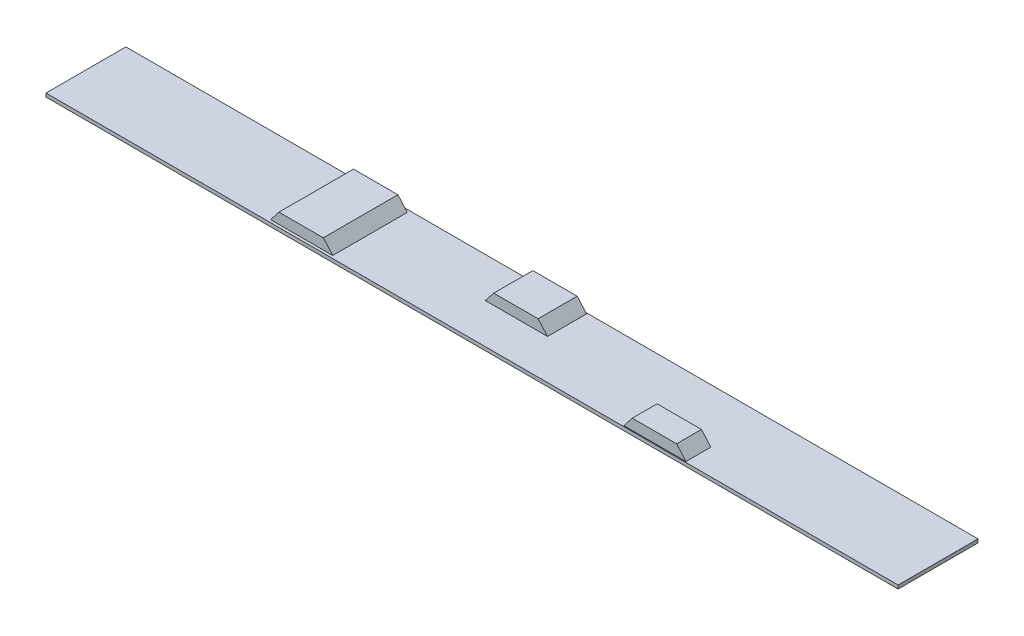
ISO-10303-21;
HEADER;
FILE_DESCRIPTION(('STEP AP214'),'2;1');
FILE_NAME('part.step','',(''),(''),'','','');
FILE_SCHEMA(('AUTOMOTIVE_DESIGN { 1 0 10303 214 1 1 1 1 }'));
ENDSEC;
DATA;
#1=APPLICATION_CONTEXT('core data for automotive mechanical design processes');
#2=APPLICATION_PROTOCOL_DEFINITION('international standard','automotive_design',2000,#1);
#3=PRODUCT_CONTEXT('',#1,'mechanical');
#4=PRODUCT('Part','Part','',(#3));
#5=PRODUCT_RELATED_PRODUCT_CATEGORY('part','',(#4));
#6=PRODUCT_DEFINITION_FORMATION('','',#4);
#7=PRODUCT_DEFINITION_CONTEXT('part definition',#1,'design');
#8=PRODUCT_DEFINITION('design','',#6,#7);
#9=PRODUCT_DEFINITION_SHAPE('','',#8);
#10=(LENGTH_UNIT() NAMED_UNIT(*) SI_UNIT(.MILLI.,.METRE.));
#11=(NAMED_UNIT(*) PLANE_ANGLE_UNIT() SI_UNIT($,.RADIAN.));
#12=(NAMED_UNIT(*) SI_UNIT($,.STERADIAN.) SOLID_ANGLE_UNIT());
#13=UNCERTAINTY_MEASURE_WITH_UNIT(LENGTH_MEASURE(1.E-05),#10,'distance_accuracy_value','');
#14=(GEOMETRIC_REPRESENTATION_CONTEXT(3) GLOBAL_UNCERTAINTY_ASSIGNED_CONTEXT((#13)) GLOBAL_UNIT_ASSIGNED_CONTEXT((#10,
#11,#12)) REPRESENTATION_CONTEXT('',''));
#15=CARTESIAN_POINT('',(0.,0.,0.));
#16=DIRECTION('',(0.,0.,1.));
#17=DIRECTION('',(1.,0.,0.));
#18=AXIS2_PLACEMENT_3D('',#15,#16,#17);
#19=CARTESIAN_POINT('',(0.,10.,0.));
#20=DIRECTION('',(0.,1.,0.));
#21=DIRECTION('',(0.,0.,1.));
#22=AXIS2_PLACEMENT_3D('',#19,#20,#21);
#23=PLANE('',#22);
#24=DIRECTION('',(1.,0.,0.));
#25=VECTOR('',#24,1.);
#26=CARTESIAN_POINT('',(-575.,9.999999999993,105.));
#27=LINE('',#26,#25);
#28=CARTESIAN_POINT('',(-575.,9.999999999993,105.));
#29=VERTEX_POINT('',#28);
#30=CARTESIAN_POINT('',(-400.,9.99999999999301,105.));
#31=VERTEX_POINT('',#30);
#32=EDGE_CURVE('E162',#29,#31,#27,.T.);
#33=ORIENTED_EDGE('',*,*,#32,.F.);
#34=DIRECTION('',(0.,0.,-1.));
#35=VECTOR('',#34,1.);
#36=CARTESIAN_POINT('',(-575.,9.999999999993,105.));
#37=LINE('',#36,#35);
#38=CARTESIAN_POINT('',(-575.,9.999999999993,-105.));
#39=VERTEX_POINT('',#38);
#40=EDGE_CURVE('E173',#29,#39,#37,.T.);
#41=ORIENTED_EDGE('',*,*,#40,.T.);
#42=DIRECTION('',(1.,0.,0.));
#43=VECTOR('',#42,1.);
#44=CARTESIAN_POINT('',(-575.,9.999999999993,-105.));
#45=LINE('',#44,#43);
#46=CARTESIAN_POINT('',(-400.,10.,-105.));
#47=VERTEX_POINT('',#46);
#48=EDGE_CURVE('E165',#39,#47,#45,.T.);
#49=ORIENTED_EDGE('',*,*,#48,.T.);
#50=DIRECTION('',(0.,0.,-1.));
#51=VECTOR('',#50,1.);
#52=CARTESIAN_POINT('',(-400.,9.99999999999301,105.));
#53=LINE('',#52,#51);
#54=EDGE_CURVE('E478',#31,#47,#53,.T.);
#55=ORIENTED_EDGE('',*,*,#54,.F.);
#56=EDGE_LOOP('',(#33,#41,#49,#55));
#57=FACE_BOUND('',#56,.T.);
#58=DIRECTION('',(1.,0.,0.));
#59=VECTOR('',#58,1.);
#60=CARTESIAN_POINT('',(600.,9.99999999999999,110.));
#61=LINE('',#60,#59);
#62=CARTESIAN_POINT('',(425.,9.99999999999998,110.));
#63=VERTEX_POINT('',#62);
#64=CARTESIAN_POINT('',(600.,9.99999999999999,110.));
#65=VERTEX_POINT('',#64);
#66=EDGE_CURVE('E213',#63,#65,#61,.T.);
#67=ORIENTED_EDGE('',*,*,#66,.F.);
#68=DIRECTION('',(0.,0.,-1.));
#69=VECTOR('',#68,1.);
#70=CARTESIAN_POINT('',(425.,9.99999999999998,110.));
#71=LINE('',#70,#69);
#72=CARTESIAN_POINT('',(425.,9.99999999999998,40.));
#73=VERTEX_POINT('',#72);
#74=EDGE_CURVE('E226',#63,#73,#71,.T.);
#75=ORIENTED_EDGE('',*,*,#74,.T.);
#76=DIRECTION('',(1.,0.,0.));
#77=VECTOR('',#76,1.);
#78=CARTESIAN_POINT('',(600.,9.99999999999999,40.));
#79=LINE('',#78,#77);
#80=CARTESIAN_POINT('',(600.,10.,40.));
#81=VERTEX_POINT('',#80);
#82=EDGE_CURVE('E209',#73,#81,#79,.T.);
#83=ORIENTED_EDGE('',*,*,#82,.T.);
#84=DIRECTION('',(0.,0.,-1.));
#85=VECTOR('',#84,1.);
#86=CARTESIAN_POINT('',(600.,9.99999999999999,110.));
#87=LINE('',#86,#85);
#88=EDGE_CURVE('E215',#65,#81,#87,.T.);
#89=ORIENTED_EDGE('',*,*,#88,.F.);
#90=EDGE_LOOP('',(#67,#75,#83,#89));
#91=FACE_BOUND('',#90,.T.);
#92=DIRECTION('',(0.,0.,-1.));
#93=VECTOR('',#92,1.);
#94=CARTESIAN_POINT('',(1200.,10.,-112.5));
#95=LINE('',#94,#93);
#96=CARTESIAN_POINT('',(1200.,10.,112.5));
#97=VERTEX_POINT('',#96);
#98=CARTESIAN_POINT('',(1200.,10.,-112.5));
#99=VERTEX_POINT('',#98);
#100=EDGE_CURVE('E236',#97,#99,#95,.T.);
#101=ORIENTED_EDGE('',*,*,#100,.T.);
#102=DIRECTION('',(-1.,0.,0.));
#103=VECTOR('',#102,1.);
#104=CARTESIAN_POINT('',(-1200.,10.,-112.5));
#105=LINE('',#104,#103);
#106=CARTESIAN_POINT('',(-1200.,10.,-112.5));
#107=VERTEX_POINT('',#106);
#108=EDGE_CURVE('E239',#99,#107,#105,.T.);
#109=ORIENTED_EDGE('',*,*,#108,.T.);
#110=DIRECTION('',(0.,0.,1.));
#111=VECTOR('',#110,1.);
#112=CARTESIAN_POINT('',(-1200.,10.,-112.5));
#113=LINE('',#112,#111);
#114=CARTESIAN_POINT('',(-1200.,10.,112.5));
#115=VERTEX_POINT('',#114);
#116=EDGE_CURVE('E242',#107,#115,#113,.T.);
#117=ORIENTED_EDGE('',*,*,#116,.T.);
#118=DIRECTION('',(1.,0.,0.));
#119=VECTOR('',#118,1.);
#120=CARTESIAN_POINT('',(-1200.,10.,112.5));
#121=LINE('',#120,#119);
#122=EDGE_CURVE('E244',#115,#97,#121,.T.);
#123=ORIENTED_EDGE('',*,*,#122,.T.);
#124=EDGE_LOOP('',(#101,#109,#117,#123));
#125=FACE_BOUND('',#124,.T.);
#126=DIRECTION('',(0.,0.,1.));
#127=VECTOR('',#126,1.);
#128=CARTESIAN_POINT('',(-75.0000000000002,9.99999999999649,-110.));
#129=LINE('',#128,#127);
#130=CARTESIAN_POINT('',(-74.9999999999975,10.,-110.));
#131=VERTEX_POINT('',#130);
#132=CARTESIAN_POINT('',(-75.0000000000002,10.,0.));
#133=VERTEX_POINT('',#132);
#134=EDGE_CURVE('E199',#131,#133,#129,.T.);
#135=ORIENTED_EDGE('',*,*,#134,.F.);
#136=DIRECTION('',(1.,0.,0.));
#137=VECTOR('',#136,1.);
#138=CARTESIAN_POINT('',(-75.0000000000002,9.99999999999649,-110.));
#139=LINE('',#138,#137);
#140=CARTESIAN_POINT('',(99.9999999999967,10.,-110.));
#141=VERTEX_POINT('',#140);
#142=EDGE_CURVE('E56',#131,#141,#139,.T.);
#143=ORIENTED_EDGE('',*,*,#142,.T.);
#144=DIRECTION('',(0.,0.,1.));
#145=VECTOR('',#144,1.);
#146=CARTESIAN_POINT('',(99.9999999999998,9.9999999999965,-110.));
#147=LINE('',#146,#145);
#148=CARTESIAN_POINT('',(99.9999999999998,9.9999999999965,0.));
#149=VERTEX_POINT('',#148);
#150=EDGE_CURVE('E196',#141,#149,#147,.T.);
#151=ORIENTED_EDGE('',*,*,#150,.T.);
#152=DIRECTION('',(1.,0.,0.));
#153=VECTOR('',#152,1.);
#154=CARTESIAN_POINT('',(-75.0000000000002,9.99999999999649,0.));
#155=LINE('',#154,#153);
#156=EDGE_CURVE('E181',#133,#149,#155,.T.);
#157=ORIENTED_EDGE('',*,*,#156,.F.);
#158=EDGE_LOOP('',(#135,#143,#151,#157));
#159=FACE_BOUND('',#158,.T.);
#160=ADVANCED_FACE('F33',(#57,#91,#125,#159),#23,.T.);
#161=CARTESIAN_POINT('',(1200.,10.,-112.5));
#162=DIRECTION('',(-1.,0.,0.));
#163=DIRECTION('',(0.,0.,1.));
#164=AXIS2_PLACEMENT_3D('',#161,#162,#163);
#165=PLANE('',#164);
#166=DIRECTION('',(0.,0.,-1.));
#167=VECTOR('',#166,1.);
#168=CARTESIAN_POINT('',(1200.,0.,-112.5));
#169=LINE('',#168,#167);
#170=CARTESIAN_POINT('',(1200.,0.,112.5));
#171=VERTEX_POINT('',#170);
#172=CARTESIAN_POINT('',(1200.,0.,-112.5));
#173=VERTEX_POINT('',#172);
#174=EDGE_CURVE('E235',#171,#173,#169,.T.);
#175=ORIENTED_EDGE('',*,*,#174,.T.);
#176=DIRECTION('',(0.,-1.,0.));
#177=VECTOR('',#176,1.);
#178=CARTESIAN_POINT('',(1200.,10.,-112.5));
#179=LINE('',#178,#177);
#180=EDGE_CURVE('E11',#99,#173,#179,.T.);
#181=ORIENTED_EDGE('',*,*,#180,.F.);
#182=ORIENTED_EDGE('',*,*,#100,.F.);
#183=DIRECTION('',(0.,-1.,0.));
#184=VECTOR('',#183,1.);
#185=CARTESIAN_POINT('',(1200.,10.,112.5));
#186=LINE('',#185,#184);
#187=EDGE_CURVE('E246',#97,#171,#186,.T.);
#188=ORIENTED_EDGE('',*,*,#187,.T.);
#189=EDGE_LOOP('',(#175,#181,#182,#188));
#190=FACE_BOUND('',#189,.T.);
#191=ADVANCED_FACE('F35',(#190),#165,.F.);
#192=CARTESIAN_POINT('',(-1200.,10.,-112.5));
#193=DIRECTION('',(0.,0.,1.));
#194=DIRECTION('',(1.,0.,0.));
#195=AXIS2_PLACEMENT_3D('',#192,#193,#194);
#196=PLANE('',#195);
#197=DIRECTION('',(-1.,0.,0.));
#198=VECTOR('',#197,1.);
#199=CARTESIAN_POINT('',(-1200.,0.,-112.5));
#200=LINE('',#199,#198);
#201=CARTESIAN_POINT('',(-1200.,0.,-112.5));
#202=VERTEX_POINT('',#201);
#203=EDGE_CURVE('E249',#173,#202,#200,.T.);
#204=ORIENTED_EDGE('',*,*,#203,.T.);
#205=DIRECTION('',(0.,-1.,0.));
#206=VECTOR('',#205,1.);
#207=CARTESIAN_POINT('',(-1200.,10.,-112.5));
#208=LINE('',#207,#206);
#209=EDGE_CURVE('E41',#107,#202,#208,.T.);
#210=ORIENTED_EDGE('',*,*,#209,.F.);
#211=ORIENTED_EDGE('',*,*,#108,.F.);
#212=ORIENTED_EDGE('',*,*,#180,.T.);
#213=EDGE_LOOP('',(#204,#210,#211,#212));
#214=FACE_BOUND('',#213,.T.);
#215=ADVANCED_FACE('F278',(#214),#196,.F.);
#216=CARTESIAN_POINT('',(-1200.,10.,-112.5));
#217=DIRECTION('',(1.,0.,0.));
#218=DIRECTION('',(0.,0.,-1.));
#219=AXIS2_PLACEMENT_3D('',#216,#217,#218);
#220=PLANE('',#219);
#221=DIRECTION('',(0.,0.,1.));
#222=VECTOR('',#221,1.);
#223=CARTESIAN_POINT('',(-1200.,0.,-112.5));
#224=LINE('',#223,#222);
#225=CARTESIAN_POINT('',(-1200.,0.,112.5));
#226=VERTEX_POINT('',#225);
#227=EDGE_CURVE('E251',#202,#226,#224,.T.);
#228=ORIENTED_EDGE('',*,*,#227,.T.);
#229=DIRECTION('',(0.,-1.,0.));
#230=VECTOR('',#229,1.);
#231=CARTESIAN_POINT('',(-1200.,10.,112.5));
#232=LINE('',#231,#230);
#233=EDGE_CURVE('E256',#115,#226,#232,.T.);
#234=ORIENTED_EDGE('',*,*,#233,.F.);
#235=ORIENTED_EDGE('',*,*,#116,.F.);
#236=ORIENTED_EDGE('',*,*,#209,.T.);
#237=EDGE_LOOP('',(#228,#234,#235,#236));
#238=FACE_BOUND('',#237,.T.);
#239=ADVANCED_FACE('F263',(#238),#220,.F.);
#240=CARTESIAN_POINT('',(-1200.,10.,112.5));
#241=DIRECTION('',(0.,0.,-1.));
#242=DIRECTION('',(-1.,0.,0.));
#243=AXIS2_PLACEMENT_3D('',#240,#241,#242);
#244=PLANE('',#243);
#245=DIRECTION('',(1.,0.,0.));
#246=VECTOR('',#245,1.);
#247=CARTESIAN_POINT('',(-1200.,0.,112.5));
#248=LINE('',#247,#246);
#249=EDGE_CURVE('E240',#226,#171,#248,.T.);
#250=ORIENTED_EDGE('',*,*,#249,.T.);
#251=ORIENTED_EDGE('',*,*,#187,.F.);
#252=ORIENTED_EDGE('',*,*,#122,.F.);
#253=ORIENTED_EDGE('',*,*,#233,.T.);
#254=EDGE_LOOP('',(#250,#251,#252,#253));
#255=FACE_BOUND('',#254,.T.);
#256=ADVANCED_FACE('F272',(#255),#244,.F.);
#257=CARTESIAN_POINT('',(0.,0.,0.));
#258=DIRECTION('',(0.,1.,0.));
#259=DIRECTION('',(0.,0.,1.));
#260=AXIS2_PLACEMENT_3D('',#257,#258,#259);
#261=PLANE('',#260);
#262=ORIENTED_EDGE('',*,*,#174,.F.);
#263=ORIENTED_EDGE('',*,*,#249,.F.);
#264=ORIENTED_EDGE('',*,*,#227,.F.);
#265=ORIENTED_EDGE('',*,*,#203,.F.);
#266=EDGE_LOOP('',(#262,#263,#264,#265));
#267=FACE_BOUND('',#266,.T.);
#268=ADVANCED_FACE('F269',(#267),#261,.F.);
#269=CARTESIAN_POINT('',(600.,9.99999999999999,110.));
#270=DIRECTION('',(-0.750832839736111,-0.660492276089439,0.));
#271=DIRECTION('',(0.660492276089439,-0.750832839736111,0.));
#272=AXIS2_PLACEMENT_3D('',#269,#270,#271);
#273=PLANE('',#272);
#274=DIRECTION('',(-0.660492276089439,0.750832839736111,0.));
#275=VECTOR('',#274,1.);
#276=CARTESIAN_POINT('',(600.,9.99999999999999,40.));
#277=LINE('',#276,#275);
#278=CARTESIAN_POINT('',(573.609614238973,40.,40.));
#279=VERTEX_POINT('',#278);
#280=EDGE_CURVE('E198',#81,#279,#277,.T.);
#281=ORIENTED_EDGE('',*,*,#280,.T.);
#282=DIRECTION('',(0.,0.,-1.));
#283=VECTOR('',#282,1.);
#284=CARTESIAN_POINT('',(573.609614238973,40.,110.));
#285=LINE('',#284,#283);
#286=CARTESIAN_POINT('',(573.609614238973,40.,110.));
#287=VERTEX_POINT('',#286);
#288=EDGE_CURVE('E232',#287,#279,#285,.T.);
#289=ORIENTED_EDGE('',*,*,#288,.F.);
#290=DIRECTION('',(-0.660492276089439,0.750832839736111,0.));
#291=VECTOR('',#290,1.);
#292=CARTESIAN_POINT('',(600.,9.99999999999999,110.));
#293=LINE('',#292,#291);
#294=EDGE_CURVE('E205',#65,#287,#293,.T.);
#295=ORIENTED_EDGE('',*,*,#294,.F.);
#296=ORIENTED_EDGE('',*,*,#88,.T.);
#297=EDGE_LOOP('',(#281,#289,#295,#296));
#298=FACE_BOUND('',#297,.T.);
#299=ADVANCED_FACE('F293',(#298),#273,.F.);
#300=CARTESIAN_POINT('',(573.609614238973,40.,110.));
#301=DIRECTION('',(0.,-1.,0.));
#302=DIRECTION('',(1.,0.,0.));
#303=AXIS2_PLACEMENT_3D('',#300,#301,#302);
#304=PLANE('',#303);
#305=DIRECTION('',(-1.,0.,0.));
#306=VECTOR('',#305,1.);
#307=CARTESIAN_POINT('',(573.609614238973,40.,40.));
#308=LINE('',#307,#306);
#309=CARTESIAN_POINT('',(448.609614238973,40.,40.));
#310=VERTEX_POINT('',#309);
#311=EDGE_CURVE('E218',#279,#310,#308,.T.);
#312=ORIENTED_EDGE('',*,*,#311,.T.);
#313=DIRECTION('',(0.,0.,-1.));
#314=VECTOR('',#313,1.);
#315=CARTESIAN_POINT('',(448.609614238973,40.,110.));
#316=LINE('',#315,#314);
#317=CARTESIAN_POINT('',(448.609614238973,40.,110.));
#318=VERTEX_POINT('',#317);
#319=EDGE_CURVE('E229',#318,#310,#316,.T.);
#320=ORIENTED_EDGE('',*,*,#319,.F.);
#321=DIRECTION('',(-1.,0.,0.));
#322=VECTOR('',#321,1.);
#323=CARTESIAN_POINT('',(573.609614238973,40.,110.));
#324=LINE('',#323,#322);
#325=EDGE_CURVE('E208',#287,#318,#324,.T.);
#326=ORIENTED_EDGE('',*,*,#325,.F.);
#327=ORIENTED_EDGE('',*,*,#288,.T.);
#328=EDGE_LOOP('',(#312,#320,#326,#327));
#329=FACE_BOUND('',#328,.T.);
#330=ADVANCED_FACE('F312',(#329),#304,.F.);
#331=CARTESIAN_POINT('',(448.609614238973,40.,110.));
#332=DIRECTION('',(0.785832169323505,-0.61843981247678,0.));
#333=DIRECTION('',(0.61843981247678,0.785832169323505,0.));
#334=AXIS2_PLACEMENT_3D('',#331,#332,#333);
#335=PLANE('',#334);
#336=DIRECTION('',(-0.61843981247678,-0.785832169323505,0.));
#337=VECTOR('',#336,1.);
#338=CARTESIAN_POINT('',(448.609614238973,40.,40.));
#339=LINE('',#338,#337);
#340=EDGE_CURVE('E220',#310,#73,#339,.T.);
#341=ORIENTED_EDGE('',*,*,#340,.T.);
#342=ORIENTED_EDGE('',*,*,#74,.F.);
#343=DIRECTION('',(-0.61843981247678,-0.785832169323505,0.));
#344=VECTOR('',#343,1.);
#345=CARTESIAN_POINT('',(448.609614238973,40.,110.));
#346=LINE('',#345,#344);
#347=EDGE_CURVE('E211',#318,#63,#346,.T.);
#348=ORIENTED_EDGE('',*,*,#347,.F.);
#349=ORIENTED_EDGE('',*,*,#319,.T.);
#350=EDGE_LOOP('',(#341,#342,#348,#349));
#351=FACE_BOUND('',#350,.T.);
#352=ADVANCED_FACE('F319',(#351),#335,.F.);
#353=CARTESIAN_POINT('',(0.,0.,110.));
#354=DIRECTION('',(0.,0.,1.));
#355=DIRECTION('',(1.,0.,0.));
#356=AXIS2_PLACEMENT_3D('',#353,#354,#355);
#357=PLANE('',#356);
#358=ORIENTED_EDGE('',*,*,#294,.T.);
#359=ORIENTED_EDGE('',*,*,#325,.T.);
#360=ORIENTED_EDGE('',*,*,#347,.T.);
#361=ORIENTED_EDGE('',*,*,#66,.T.);
#362=EDGE_LOOP('',(#358,#359,#360,#361));
#363=FACE_BOUND('',#362,.T.);
#364=ADVANCED_FACE('F326',(#363),#357,.T.);
#365=CARTESIAN_POINT('',(0.,0.,40.));
#366=DIRECTION('',(0.,0.,1.));
#367=DIRECTION('',(1.,0.,0.));
#368=AXIS2_PLACEMENT_3D('',#365,#366,#367);
#369=PLANE('',#368);
#370=ORIENTED_EDGE('',*,*,#280,.F.);
#371=ORIENTED_EDGE('',*,*,#82,.F.);
#372=ORIENTED_EDGE('',*,*,#340,.F.);
#373=ORIENTED_EDGE('',*,*,#311,.F.);
#374=EDGE_LOOP('',(#370,#371,#372,#373));
#375=FACE_BOUND('',#374,.T.);
#376=ADVANCED_FACE('F334',(#375),#369,.F.);
#377=CARTESIAN_POINT('',(99.9999999999998,9.9999999999965,-110.));
#378=DIRECTION('',(0.750832839736111,0.660492276089439,0.));
#379=DIRECTION('',(-0.660492276089439,0.750832839736111,0.));
#380=AXIS2_PLACEMENT_3D('',#377,#378,#379);
#381=PLANE('',#380);
#382=DIRECTION('',(-0.660492276089439,0.750832839736111,0.));
#383=VECTOR('',#382,1.);
#384=CARTESIAN_POINT('',(99.9999999999998,9.9999999999965,0.));
#385=LINE('',#384,#383);
#386=CARTESIAN_POINT('',(73.6096142389729,39.9999999999965,0.));
#387=VERTEX_POINT('',#386);
#388=EDGE_CURVE('E168',#149,#387,#385,.T.);
#389=ORIENTED_EDGE('',*,*,#388,.F.);
#390=ORIENTED_EDGE('',*,*,#150,.F.);
#391=DIRECTION('',(-0.660492276089439,0.750832839736111,0.));
#392=VECTOR('',#391,1.);
#393=CARTESIAN_POINT('',(99.9999999999998,9.9999999999965,-110.));
#394=LINE('',#393,#392);
#395=CARTESIAN_POINT('',(73.6096142389729,39.9999999999965,-110.));
#396=VERTEX_POINT('',#395);
#397=EDGE_CURVE('E177',#141,#396,#394,.T.);
#398=ORIENTED_EDGE('',*,*,#397,.T.);
#399=DIRECTION('',(0.,0.,1.));
#400=VECTOR('',#399,1.);
#401=CARTESIAN_POINT('',(73.6096142389729,39.9999999999965,-110.));
#402=LINE('',#401,#400);
#403=EDGE_CURVE('E187',#396,#387,#402,.T.);
#404=ORIENTED_EDGE('',*,*,#403,.T.);
#405=EDGE_LOOP('',(#389,#390,#398,#404));
#406=FACE_BOUND('',#405,.T.);
#407=ADVANCED_FACE('F342',(#406),#381,.T.);
#408=CARTESIAN_POINT('',(-51.3903857610271,39.9999999999965,-110.));
#409=DIRECTION('',(-0.785832169323505,0.61843981247678,0.));
#410=DIRECTION('',(-0.61843981247678,-0.785832169323505,0.));
#411=AXIS2_PLACEMENT_3D('',#408,#409,#410);
#412=PLANE('',#411);
#413=DIRECTION('',(-0.61843981247678,-0.785832169323505,0.));
#414=VECTOR('',#413,1.);
#415=CARTESIAN_POINT('',(-51.3903857610271,39.9999999999965,0.));
#416=LINE('',#415,#414);
#417=CARTESIAN_POINT('',(-51.3903857610271,39.9999999999965,0.));
#418=VERTEX_POINT('',#417);
#419=EDGE_CURVE('E191',#418,#133,#416,.T.);
#420=ORIENTED_EDGE('',*,*,#419,.F.);
#421=DIRECTION('',(0.,0.,1.));
#422=VECTOR('',#421,1.);
#423=CARTESIAN_POINT('',(-51.3903857610271,39.9999999999965,-110.));
#424=LINE('',#423,#422);
#425=CARTESIAN_POINT('',(-51.3903857610271,39.9999999999965,-110.));
#426=VERTEX_POINT('',#425);
#427=EDGE_CURVE('E202',#426,#418,#424,.T.);
#428=ORIENTED_EDGE('',*,*,#427,.F.);
#429=DIRECTION('',(-0.61843981247678,-0.785832169323505,0.));
#430=VECTOR('',#429,1.);
#431=CARTESIAN_POINT('',(-51.3903857610271,39.9999999999965,-110.));
#432=LINE('',#431,#430);
#433=EDGE_CURVE('E184',#426,#131,#432,.T.);
#434=ORIENTED_EDGE('',*,*,#433,.T.);
#435=ORIENTED_EDGE('',*,*,#134,.T.);
#436=EDGE_LOOP('',(#420,#428,#434,#435));
#437=FACE_BOUND('',#436,.T.);
#438=ADVANCED_FACE('F350',(#437),#412,.T.);
#439=CARTESIAN_POINT('',(73.6096142389729,39.9999999999965,-110.));
#440=DIRECTION('',(0.,1.,0.));
#441=DIRECTION('',(-1.,0.,0.));
#442=AXIS2_PLACEMENT_3D('',#439,#440,#441);
#443=PLANE('',#442);
#444=DIRECTION('',(-1.,0.,0.));
#445=VECTOR('',#444,1.);
#446=CARTESIAN_POINT('',(73.6096142389729,39.9999999999965,0.));
#447=LINE('',#446,#445);
#448=EDGE_CURVE('E171',#387,#418,#447,.T.);
#449=ORIENTED_EDGE('',*,*,#448,.F.);
#450=ORIENTED_EDGE('',*,*,#403,.F.);
#451=DIRECTION('',(-1.,0.,0.));
#452=VECTOR('',#451,1.);
#453=CARTESIAN_POINT('',(73.6096142389729,39.9999999999965,-110.));
#454=LINE('',#453,#452);
#455=EDGE_CURVE('E180',#396,#426,#454,.T.);
#456=ORIENTED_EDGE('',*,*,#455,.T.);
#457=ORIENTED_EDGE('',*,*,#427,.T.);
#458=EDGE_LOOP('',(#449,#450,#456,#457));
#459=FACE_BOUND('',#458,.T.);
#460=ADVANCED_FACE('F358',(#459),#443,.T.);
#461=CARTESIAN_POINT('',(0.,0.,-110.));
#462=DIRECTION('',(0.,0.,1.));
#463=DIRECTION('',(1.,0.,0.));
#464=AXIS2_PLACEMENT_3D('',#461,#462,#463);
#465=PLANE('',#464);
#466=ORIENTED_EDGE('',*,*,#397,.F.);
#467=ORIENTED_EDGE('',*,*,#142,.F.);
#468=ORIENTED_EDGE('',*,*,#433,.F.);
#469=ORIENTED_EDGE('',*,*,#455,.F.);
#470=EDGE_LOOP('',(#466,#467,#468,#469));
#471=FACE_BOUND('',#470,.T.);
#472=ADVANCED_FACE('F366',(#471),#465,.F.);
#473=CARTESIAN_POINT('',(0.,0.,0.));
#474=DIRECTION('',(0.,0.,1.));
#475=DIRECTION('',(1.,0.,0.));
#476=AXIS2_PLACEMENT_3D('',#473,#474,#475);
#477=PLANE('',#476);
#478=ORIENTED_EDGE('',*,*,#388,.T.);
#479=ORIENTED_EDGE('',*,*,#448,.T.);
#480=ORIENTED_EDGE('',*,*,#419,.T.);
#481=ORIENTED_EDGE('',*,*,#156,.T.);
#482=EDGE_LOOP('',(#478,#479,#480,#481));
#483=FACE_BOUND('',#482,.T.);
#484=ADVANCED_FACE('F374',(#483),#477,.T.);
#485=CARTESIAN_POINT('',(-400.,9.99999999999301,105.));
#486=DIRECTION('',(-0.750832839736111,-0.660492276089439,0.));
#487=DIRECTION('',(0.660492276089439,-0.750832839736111,0.));
#488=AXIS2_PLACEMENT_3D('',#485,#486,#487);
#489=PLANE('',#488);
#490=DIRECTION('',(-0.660492276089439,0.750832839736111,0.));
#491=VECTOR('',#490,1.);
#492=CARTESIAN_POINT('',(-400.,9.99999999999301,-105.));
#493=LINE('',#492,#491);
#494=CARTESIAN_POINT('',(-426.390385761027,39.999999999993,-105.));
#495=VERTEX_POINT('',#494);
#496=EDGE_CURVE('E48',#47,#495,#493,.T.);
#497=ORIENTED_EDGE('',*,*,#496,.T.);
#498=DIRECTION('',(0.,0.,-1.));
#499=VECTOR('',#498,1.);
#500=CARTESIAN_POINT('',(-426.390385761027,39.999999999993,105.));
#501=LINE('',#500,#499);
#502=CARTESIAN_POINT('',(-426.390385761027,39.999999999993,105.));
#503=VERTEX_POINT('',#502);
#504=EDGE_CURVE('E151',#503,#495,#501,.T.);
#505=ORIENTED_EDGE('',*,*,#504,.F.);
#506=DIRECTION('',(-0.660492276089439,0.750832839736111,0.));
#507=VECTOR('',#506,1.);
#508=CARTESIAN_POINT('',(-400.,9.99999999999301,105.));
#509=LINE('',#508,#507);
#510=EDGE_CURVE('E157',#31,#503,#509,.T.);
#511=ORIENTED_EDGE('',*,*,#510,.F.);
#512=ORIENTED_EDGE('',*,*,#54,.T.);
#513=EDGE_LOOP('',(#497,#505,#511,#512));
#514=FACE_BOUND('',#513,.T.);
#515=ADVANCED_FACE('F167',(#514),#489,.F.);
#516=CARTESIAN_POINT('',(-426.390385761027,39.999999999993,105.));
#517=DIRECTION('',(0.,-1.,0.));
#518=DIRECTION('',(1.,0.,0.));
#519=AXIS2_PLACEMENT_3D('',#516,#517,#518);
#520=PLANE('',#519);
#521=DIRECTION('',(-1.,0.,0.));
#522=VECTOR('',#521,1.);
#523=CARTESIAN_POINT('',(-426.390385761027,39.999999999993,-105.));
#524=LINE('',#523,#522);
#525=CARTESIAN_POINT('',(-551.390385761027,39.999999999993,-105.));
#526=VERTEX_POINT('',#525);
#527=EDGE_CURVE('E474',#495,#526,#524,.T.);
#528=ORIENTED_EDGE('',*,*,#527,.T.);
#529=DIRECTION('',(0.,0.,-1.));
#530=VECTOR('',#529,1.);
#531=CARTESIAN_POINT('',(-551.390385761027,39.999999999993,105.));
#532=LINE('',#531,#530);
#533=CARTESIAN_POINT('',(-551.390385761027,39.999999999993,105.));
#534=VERTEX_POINT('',#533);
#535=EDGE_CURVE('E153',#534,#526,#532,.T.);
#536=ORIENTED_EDGE('',*,*,#535,.F.);
#537=DIRECTION('',(-1.,0.,0.));
#538=VECTOR('',#537,1.);
#539=CARTESIAN_POINT('',(-426.390385761027,39.999999999993,105.));
#540=LINE('',#539,#538);
#541=EDGE_CURVE('E147',#503,#534,#540,.T.);
#542=ORIENTED_EDGE('',*,*,#541,.F.);
#543=ORIENTED_EDGE('',*,*,#504,.T.);
#544=EDGE_LOOP('',(#528,#536,#542,#543));
#545=FACE_BOUND('',#544,.T.);
#546=ADVANCED_FACE('F149',(#545),#520,.F.);
#547=CARTESIAN_POINT('',(-551.390385761027,39.999999999993,105.));
#548=DIRECTION('',(0.785832169323505,-0.618439812476779,0.));
#549=DIRECTION('',(0.618439812476779,0.785832169323505,0.));
#550=AXIS2_PLACEMENT_3D('',#547,#548,#549);
#551=PLANE('',#550);
#552=DIRECTION('',(-0.618439812476779,-0.785832169323505,0.));
#553=VECTOR('',#552,1.);
#554=CARTESIAN_POINT('',(-551.390385761027,39.999999999993,-105.));
#555=LINE('',#554,#553);
#556=EDGE_CURVE('E472',#526,#39,#555,.T.);
#557=ORIENTED_EDGE('',*,*,#556,.T.);
#558=ORIENTED_EDGE('',*,*,#40,.F.);
#559=DIRECTION('',(-0.618439812476779,-0.785832169323505,0.));
#560=VECTOR('',#559,1.);
#561=CARTESIAN_POINT('',(-551.390385761027,39.999999999993,105.));
#562=LINE('',#561,#560);
#563=EDGE_CURVE('E156',#534,#29,#562,.T.);
#564=ORIENTED_EDGE('',*,*,#563,.F.);
#565=ORIENTED_EDGE('',*,*,#535,.T.);
#566=EDGE_LOOP('',(#557,#558,#564,#565));
#567=FACE_BOUND('',#566,.T.);
#568=ADVANCED_FACE('F395',(#567),#551,.F.);
#569=CARTESIAN_POINT('',(0.,0.,105.));
#570=DIRECTION('',(0.,0.,1.));
#571=DIRECTION('',(1.,0.,0.));
#572=AXIS2_PLACEMENT_3D('',#569,#570,#571);
#573=PLANE('',#572);
#574=ORIENTED_EDGE('',*,*,#510,.T.);
#575=ORIENTED_EDGE('',*,*,#541,.T.);
#576=ORIENTED_EDGE('',*,*,#563,.T.);
#577=ORIENTED_EDGE('',*,*,#32,.T.);
#578=EDGE_LOOP('',(#574,#575,#576,#577));
#579=FACE_BOUND('',#578,.T.);
#580=ADVANCED_FACE('F160',(#579),#573,.T.);
#581=CARTESIAN_POINT('',(0.,0.,-105.));
#582=DIRECTION('',(0.,0.,1.));
#583=DIRECTION('',(1.,0.,0.));
#584=AXIS2_PLACEMENT_3D('',#581,#582,#583);
#585=PLANE('',#584);
#586=ORIENTED_EDGE('',*,*,#496,.F.);
#587=ORIENTED_EDGE('',*,*,#48,.F.);
#588=ORIENTED_EDGE('',*,*,#556,.F.);
#589=ORIENTED_EDGE('',*,*,#527,.F.);
#590=EDGE_LOOP('',(#586,#587,#588,#589));
#591=FACE_BOUND('',#590,.T.);
#592=ADVANCED_FACE('F409',(#591),#585,.F.);
#593=CLOSED_SHELL('',(#160,#191,#215,#239,#256,#268,#299,#330,#352,#364,#376,#407,#438,#460,
#472,#484,#515,#546,#568,#580,#592));
#594=MANIFOLD_SOLID_BREP('B2',#593);
#595=ADVANCED_BREP_SHAPE_REPRESENTATION('',(#18,#594),#14);
#596=SHAPE_DEFINITION_REPRESENTATION(#9,#595);
ENDSEC;
END-ISO-10303-21;
